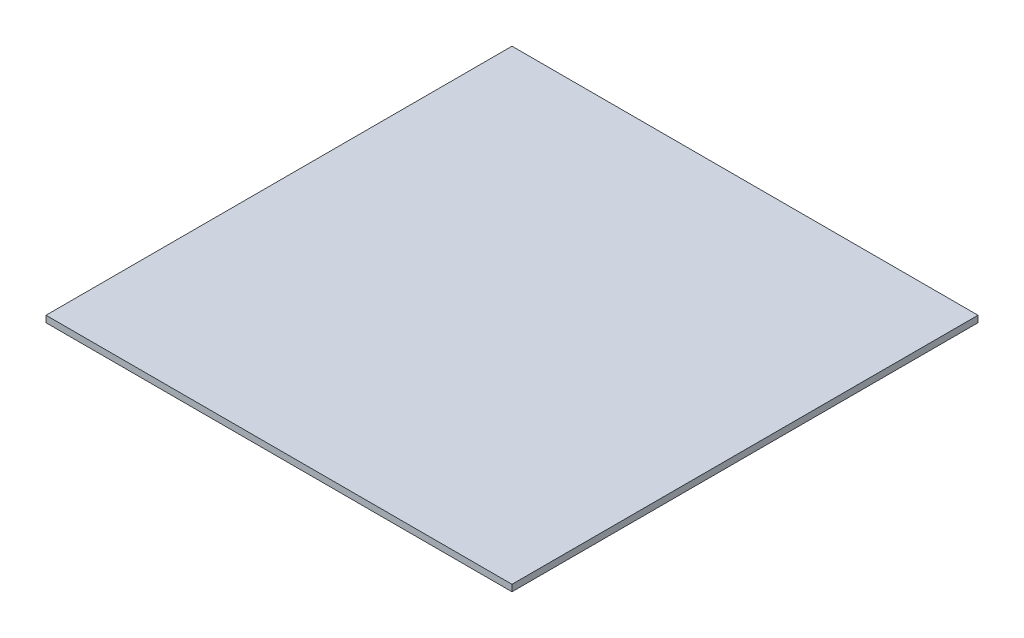
ISO-10303-21;
HEADER;
FILE_DESCRIPTION(('STEP AP214'),'2;1');
FILE_NAME('part.step','',(''),(''),'','','');
FILE_SCHEMA(('AUTOMOTIVE_DESIGN { 1 0 10303 214 1 1 1 1 }'));
ENDSEC;
DATA;
#1=APPLICATION_CONTEXT('core data for automotive mechanical design processes');
#2=APPLICATION_PROTOCOL_DEFINITION('international standard','automotive_design',2000,#1);
#3=PRODUCT_CONTEXT('',#1,'mechanical');
#4=PRODUCT('Part','Part','',(#3));
#5=PRODUCT_RELATED_PRODUCT_CATEGORY('part','',(#4));
#6=PRODUCT_DEFINITION_FORMATION('','',#4);
#7=PRODUCT_DEFINITION_CONTEXT('part definition',#1,'design');
#8=PRODUCT_DEFINITION('design','',#6,#7);
#9=PRODUCT_DEFINITION_SHAPE('','',#8);
#10=(LENGTH_UNIT() NAMED_UNIT(*) SI_UNIT(.MILLI.,.METRE.));
#11=(NAMED_UNIT(*) PLANE_ANGLE_UNIT() SI_UNIT($,.RADIAN.));
#12=(NAMED_UNIT(*) SI_UNIT($,.STERADIAN.) SOLID_ANGLE_UNIT());
#13=UNCERTAINTY_MEASURE_WITH_UNIT(LENGTH_MEASURE(1.E-05),#10,'distance_accuracy_value','');
#14=(GEOMETRIC_REPRESENTATION_CONTEXT(3) GLOBAL_UNCERTAINTY_ASSIGNED_CONTEXT((#13)) GLOBAL_UNIT_ASSIGNED_CONTEXT((#10,
#11,#12)) REPRESENTATION_CONTEXT('',''));
#15=CARTESIAN_POINT('',(0.,0.,0.));
#16=DIRECTION('',(0.,0.,1.));
#17=DIRECTION('',(1.,0.,0.));
#18=AXIS2_PLACEMENT_3D('',#15,#16,#17);
#19=CARTESIAN_POINT('',(0.,3.,0.));
#20=DIRECTION('',(1.,0.,0.));
#21=DIRECTION('',(0.,0.,-1.));
#22=AXIS2_PLACEMENT_3D('',#19,#20,#21);
#23=PLANE('',#22);
#24=DIRECTION('',(0.,0.,1.));
#25=VECTOR('',#24,1.);
#26=CARTESIAN_POINT('',(0.,0.,0.));
#27=LINE('',#26,#25);
#28=CARTESIAN_POINT('',(0.,0.,-214.));
#29=VERTEX_POINT('',#28);
#30=CARTESIAN_POINT('',(0.,0.,0.));
#31=VERTEX_POINT('',#30);
#32=EDGE_CURVE('E98',#29,#31,#27,.T.);
#33=ORIENTED_EDGE('',*,*,#32,.T.);
#34=DIRECTION('',(0.,-1.,0.));
#35=VECTOR('',#34,1.);
#36=CARTESIAN_POINT('',(0.,3.,0.));
#37=LINE('',#36,#35);
#38=CARTESIAN_POINT('',(0.,3.,0.));
#39=VERTEX_POINT('',#38);
#40=EDGE_CURVE('E11',#39,#31,#37,.T.);
#41=ORIENTED_EDGE('',*,*,#40,.F.);
#42=DIRECTION('',(0.,0.,1.));
#43=VECTOR('',#42,1.);
#44=CARTESIAN_POINT('',(0.,3.,0.));
#45=LINE('',#44,#43);
#46=CARTESIAN_POINT('',(0.,3.,-214.));
#47=VERTEX_POINT('',#46);
#48=EDGE_CURVE('E86',#47,#39,#45,.T.);
#49=ORIENTED_EDGE('',*,*,#48,.F.);
#50=DIRECTION('',(0.,-1.,0.));
#51=VECTOR('',#50,1.);
#52=CARTESIAN_POINT('',(0.,3.,-214.));
#53=LINE('',#52,#51);
#54=EDGE_CURVE('E94',#47,#29,#53,.T.);
#55=ORIENTED_EDGE('',*,*,#54,.T.);
#56=EDGE_LOOP('',(#33,#41,#49,#55));
#57=FACE_BOUND('',#56,.T.);
#58=ADVANCED_FACE('F35',(#57),#23,.F.);
#59=CARTESIAN_POINT('',(0.,3.,0.));
#60=DIRECTION('',(0.,0.,-1.));
#61=DIRECTION('',(-1.,0.,0.));
#62=AXIS2_PLACEMENT_3D('',#59,#60,#61);
#63=PLANE('',#62);
#64=DIRECTION('',(1.,0.,0.));
#65=VECTOR('',#64,1.);
#66=CARTESIAN_POINT('',(0.,0.,0.));
#67=LINE('',#66,#65);
#68=CARTESIAN_POINT('',(214.,0.,0.));
#69=VERTEX_POINT('',#68);
#70=EDGE_CURVE('E90',#31,#69,#67,.T.);
#71=ORIENTED_EDGE('',*,*,#70,.T.);
#72=DIRECTION('',(0.,-1.,0.));
#73=VECTOR('',#72,1.);
#74=CARTESIAN_POINT('',(214.,3.,0.));
#75=LINE('',#74,#73);
#76=CARTESIAN_POINT('',(214.,3.,0.));
#77=VERTEX_POINT('',#76);
#78=EDGE_CURVE('E43',#77,#69,#75,.T.);
#79=ORIENTED_EDGE('',*,*,#78,.F.);
#80=DIRECTION('',(1.,0.,0.));
#81=VECTOR('',#80,1.);
#82=CARTESIAN_POINT('',(0.,3.,0.));
#83=LINE('',#82,#81);
#84=EDGE_CURVE('E81',#39,#77,#83,.T.);
#85=ORIENTED_EDGE('',*,*,#84,.F.);
#86=ORIENTED_EDGE('',*,*,#40,.T.);
#87=EDGE_LOOP('',(#71,#79,#85,#86));
#88=FACE_BOUND('',#87,.T.);
#89=ADVANCED_FACE('F89',(#88),#63,.F.);
#90=CARTESIAN_POINT('',(214.,3.,0.));
#91=DIRECTION('',(-1.,0.,0.));
#92=DIRECTION('',(0.,0.,1.));
#93=AXIS2_PLACEMENT_3D('',#90,#91,#92);
#94=PLANE('',#93);
#95=DIRECTION('',(0.,0.,-1.));
#96=VECTOR('',#95,1.);
#97=CARTESIAN_POINT('',(214.,0.,0.));
#98=LINE('',#97,#96);
#99=CARTESIAN_POINT('',(214.,0.,-214.));
#100=VERTEX_POINT('',#99);
#101=EDGE_CURVE('E68',#69,#100,#98,.T.);
#102=ORIENTED_EDGE('',*,*,#101,.T.);
#103=DIRECTION('',(0.,-1.,0.));
#104=VECTOR('',#103,1.);
#105=CARTESIAN_POINT('',(214.,3.,-214.));
#106=LINE('',#105,#104);
#107=CARTESIAN_POINT('',(214.,3.,-214.));
#108=VERTEX_POINT('',#107);
#109=EDGE_CURVE('E91',#108,#100,#106,.T.);
#110=ORIENTED_EDGE('',*,*,#109,.F.);
#111=DIRECTION('',(0.,0.,-1.));
#112=VECTOR('',#111,1.);
#113=CARTESIAN_POINT('',(214.,3.,0.));
#114=LINE('',#113,#112);
#115=EDGE_CURVE('E84',#77,#108,#114,.T.);
#116=ORIENTED_EDGE('',*,*,#115,.F.);
#117=ORIENTED_EDGE('',*,*,#78,.T.);
#118=EDGE_LOOP('',(#102,#110,#116,#117));
#119=FACE_BOUND('',#118,.T.);
#120=ADVANCED_FACE('F92',(#119),#94,.F.);
#121=CARTESIAN_POINT('',(0.,3.,-214.));
#122=DIRECTION('',(0.,0.,1.));
#123=DIRECTION('',(1.,0.,0.));
#124=AXIS2_PLACEMENT_3D('',#121,#122,#123);
#125=PLANE('',#124);
#126=DIRECTION('',(-1.,0.,0.));
#127=VECTOR('',#126,1.);
#128=CARTESIAN_POINT('',(0.,0.,-214.));
#129=LINE('',#128,#127);
#130=EDGE_CURVE('E74',#100,#29,#129,.T.);
#131=ORIENTED_EDGE('',*,*,#130,.T.);
#132=ORIENTED_EDGE('',*,*,#54,.F.);
#133=DIRECTION('',(-1.,0.,0.));
#134=VECTOR('',#133,1.);
#135=CARTESIAN_POINT('',(0.,3.,-214.));
#136=LINE('',#135,#134);
#137=EDGE_CURVE('E51',#108,#47,#136,.T.);
#138=ORIENTED_EDGE('',*,*,#137,.F.);
#139=ORIENTED_EDGE('',*,*,#109,.T.);
#140=EDGE_LOOP('',(#131,#132,#138,#139));
#141=FACE_BOUND('',#140,.T.);
#142=ADVANCED_FACE('F105',(#141),#125,.F.);
#143=CARTESIAN_POINT('',(0.,3.,0.));
#144=DIRECTION('',(0.,-1.,0.));
#145=DIRECTION('',(0.,0.,-1.));
#146=AXIS2_PLACEMENT_3D('',#143,#144,#145);
#147=PLANE('',#146);
#148=ORIENTED_EDGE('',*,*,#48,.T.);
#149=ORIENTED_EDGE('',*,*,#84,.T.);
#150=ORIENTED_EDGE('',*,*,#115,.T.);
#151=ORIENTED_EDGE('',*,*,#137,.T.);
#152=EDGE_LOOP('',(#148,#149,#150,#151));
#153=FACE_BOUND('',#152,.T.);
#154=ADVANCED_FACE('F82',(#153),#147,.F.);
#155=CARTESIAN_POINT('',(0.,0.,0.));
#156=DIRECTION('',(0.,-1.,0.));
#157=DIRECTION('',(0.,0.,-1.));
#158=AXIS2_PLACEMENT_3D('',#155,#156,#157);
#159=PLANE('',#158);
#160=ORIENTED_EDGE('',*,*,#32,.F.);
#161=ORIENTED_EDGE('',*,*,#130,.F.);
#162=ORIENTED_EDGE('',*,*,#101,.F.);
#163=ORIENTED_EDGE('',*,*,#70,.F.);
#164=EDGE_LOOP('',(#160,#161,#162,#163));
#165=FACE_BOUND('',#164,.T.);
#166=ADVANCED_FACE('F108',(#165),#159,.T.);
#167=CLOSED_SHELL('',(#58,#89,#120,#142,#154,#166));
#168=MANIFOLD_SOLID_BREP('B2',#167);
#169=ADVANCED_BREP_SHAPE_REPRESENTATION('',(#18,#168),#14);
#170=SHAPE_DEFINITION_REPRESENTATION(#9,#169);
ENDSEC;
END-ISO-10303-21;
